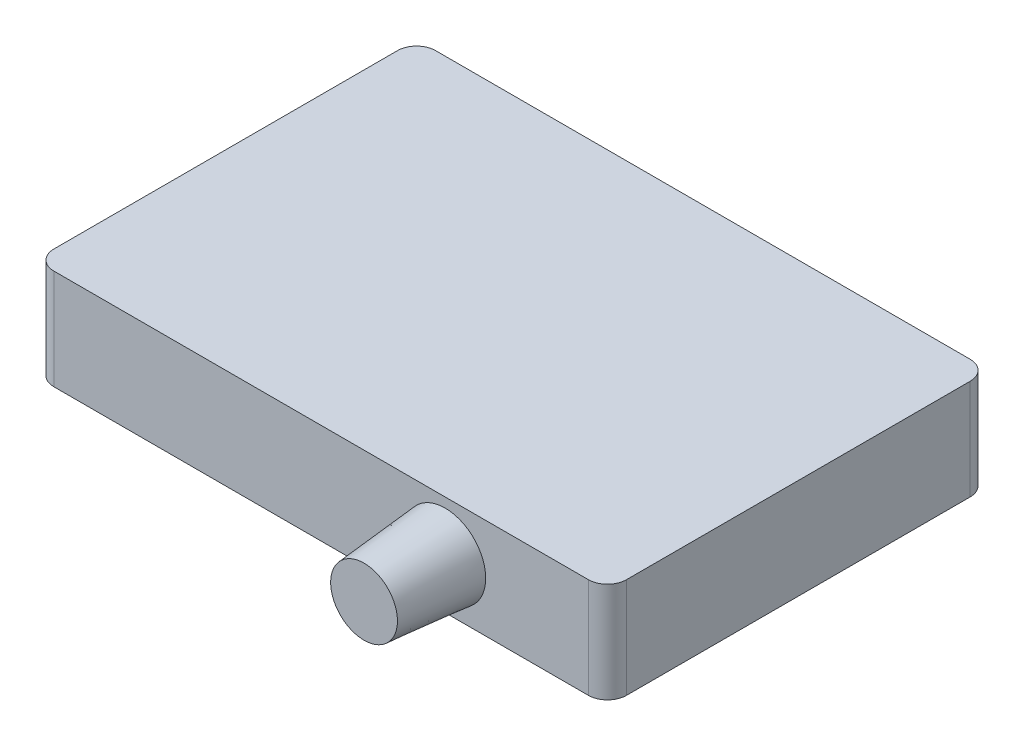
ISO-10303-21;
HEADER;
FILE_DESCRIPTION(('STEP AP214'),'2;1');
FILE_NAME('part.step','',(''),(''),'','','');
FILE_SCHEMA(('AUTOMOTIVE_DESIGN { 1 0 10303 214 1 1 1 1 }'));
ENDSEC;
DATA;
#1=APPLICATION_CONTEXT('core data for automotive mechanical design processes');
#2=APPLICATION_PROTOCOL_DEFINITION('international standard','automotive_design',2000,#1);
#3=PRODUCT_CONTEXT('',#1,'mechanical');
#4=PRODUCT('Part','Part','',(#3));
#5=PRODUCT_RELATED_PRODUCT_CATEGORY('part','',(#4));
#6=PRODUCT_DEFINITION_FORMATION('','',#4);
#7=PRODUCT_DEFINITION_CONTEXT('part definition',#1,'design');
#8=PRODUCT_DEFINITION('design','',#6,#7);
#9=PRODUCT_DEFINITION_SHAPE('','',#8);
#10=(LENGTH_UNIT() NAMED_UNIT(*) SI_UNIT(.MILLI.,.METRE.));
#11=(NAMED_UNIT(*) PLANE_ANGLE_UNIT() SI_UNIT($,.RADIAN.));
#12=(NAMED_UNIT(*) SI_UNIT($,.STERADIAN.) SOLID_ANGLE_UNIT());
#13=UNCERTAINTY_MEASURE_WITH_UNIT(LENGTH_MEASURE(1.E-05),#10,'distance_accuracy_value','');
#14=(GEOMETRIC_REPRESENTATION_CONTEXT(3) GLOBAL_UNCERTAINTY_ASSIGNED_CONTEXT((#13)) GLOBAL_UNIT_ASSIGNED_CONTEXT((#10,
#11,#12)) REPRESENTATION_CONTEXT('',''));
#15=CARTESIAN_POINT('',(0.,0.,0.));
#16=DIRECTION('',(0.,0.,1.));
#17=DIRECTION('',(1.,0.,0.));
#18=AXIS2_PLACEMENT_3D('',#15,#16,#17);
#19=CARTESIAN_POINT('',(-28.,10.5,20.));
#20=DIRECTION('',(0.,0.,-1.));
#21=DIRECTION('',(-1.,0.,0.));
#22=AXIS2_PLACEMENT_3D('',#19,#20,#21);
#23=PLANE('',#22);
#24=DIRECTION('',(1.,0.,0.));
#25=VECTOR('',#24,1.);
#26=CARTESIAN_POINT('',(-28.,0.,20.));
#27=LINE('',#26,#25);
#28=CARTESIAN_POINT('',(-28.,0.,20.));
#29=VERTEX_POINT('',#28);
#30=CARTESIAN_POINT('',(28.,0.,20.));
#31=VERTEX_POINT('',#30);
#32=EDGE_CURVE('E88',#29,#31,#27,.T.);
#33=ORIENTED_EDGE('',*,*,#32,.T.);
#34=DIRECTION('',(0.,-1.,0.));
#35=VECTOR('',#34,1.);
#36=CARTESIAN_POINT('',(28.,10.5,20.));
#37=LINE('',#36,#35);
#38=CARTESIAN_POINT('',(28.,10.5,20.));
#39=VERTEX_POINT('',#38);
#40=EDGE_CURVE('E130',#39,#31,#37,.T.);
#41=ORIENTED_EDGE('',*,*,#40,.F.);
#42=DIRECTION('',(1.,0.,0.));
#43=VECTOR('',#42,1.);
#44=CARTESIAN_POINT('',(-28.,10.5,20.));
#45=LINE('',#44,#43);
#46=CARTESIAN_POINT('',(-28.,10.5,20.));
#47=VERTEX_POINT('',#46);
#48=EDGE_CURVE('E53',#47,#39,#45,.T.);
#49=ORIENTED_EDGE('',*,*,#48,.F.);
#50=DIRECTION('',(0.,-1.,0.));
#51=VECTOR('',#50,1.);
#52=CARTESIAN_POINT('',(-28.,10.5,20.));
#53=LINE('',#52,#51);
#54=EDGE_CURVE('E126',#47,#29,#53,.T.);
#55=ORIENTED_EDGE('',*,*,#54,.T.);
#56=EDGE_LOOP('',(#33,#41,#49,#55));
#57=FACE_BOUND('',#56,.T.);
#58=CARTESIAN_POINT('',(13.,5.25,20.));
#59=DIRECTION('',(0.,0.,-1.));
#60=DIRECTION('',(-1.,0.,0.));
#61=AXIS2_PLACEMENT_3D('',#58,#59,#60);
#62=CIRCLE('',#61,4.24365363997036);
#63=CARTESIAN_POINT('',(8.75634636002963,5.25,20.));
#64=VERTEX_POINT('',#63);
#65=EDGE_CURVE('E11',#64,#64,#62,.F.);
#66=ORIENTED_EDGE('',*,*,#65,.F.);
#67=EDGE_LOOP('',(#66));
#68=FACE_BOUND('',#67,.T.);
#69=ADVANCED_FACE('F36',(#57,#68),#23,.F.);
#70=CARTESIAN_POINT('',(-28.,10.5,-20.));
#71=DIRECTION('',(0.,0.,1.));
#72=DIRECTION('',(1.,0.,0.));
#73=AXIS2_PLACEMENT_3D('',#70,#71,#72);
#74=PLANE('',#73);
#75=CARTESIAN_POINT('',(12.,4.,-20.));
#76=DIRECTION('',(0.,0.,1.));
#77=DIRECTION('',(1.,0.,0.));
#78=AXIS2_PLACEMENT_3D('',#75,#76,#77);
#79=CIRCLE('',#78,2.75);
#80=CARTESIAN_POINT('',(14.75,4.,-20.));
#81=VERTEX_POINT('',#80);
#82=EDGE_CURVE('E167',#81,#81,#79,.F.);
#83=ORIENTED_EDGE('',*,*,#82,.F.);
#84=EDGE_LOOP('',(#83));
#85=FACE_BOUND('',#84,.T.);
#86=DIRECTION('',(-1.,0.,0.));
#87=VECTOR('',#86,1.);
#88=CARTESIAN_POINT('',(-28.,0.,-20.));
#89=LINE('',#88,#87);
#90=CARTESIAN_POINT('',(28.,0.,-20.));
#91=VERTEX_POINT('',#90);
#92=CARTESIAN_POINT('',(-28.,0.,-20.));
#93=VERTEX_POINT('',#92);
#94=EDGE_CURVE('E142',#91,#93,#89,.T.);
#95=ORIENTED_EDGE('',*,*,#94,.T.);
#96=DIRECTION('',(0.,-1.,0.));
#97=VECTOR('',#96,1.);
#98=CARTESIAN_POINT('',(-28.,10.5,-20.));
#99=LINE('',#98,#97);
#100=CARTESIAN_POINT('',(-28.,10.5,-20.));
#101=VERTEX_POINT('',#100);
#102=EDGE_CURVE('E153',#101,#93,#99,.T.);
#103=ORIENTED_EDGE('',*,*,#102,.F.);
#104=DIRECTION('',(-1.,0.,0.));
#105=VECTOR('',#104,1.);
#106=CARTESIAN_POINT('',(-28.,10.5,-20.));
#107=LINE('',#106,#105);
#108=CARTESIAN_POINT('',(28.,10.5,-20.));
#109=VERTEX_POINT('',#108);
#110=EDGE_CURVE('E227',#109,#101,#107,.T.);
#111=ORIENTED_EDGE('',*,*,#110,.F.);
#112=DIRECTION('',(0.,-1.,0.));
#113=VECTOR('',#112,1.);
#114=CARTESIAN_POINT('',(28.,10.5,-20.));
#115=LINE('',#114,#113);
#116=EDGE_CURVE('E156',#109,#91,#115,.T.);
#117=ORIENTED_EDGE('',*,*,#116,.T.);
#118=EDGE_LOOP('',(#95,#103,#111,#117));
#119=FACE_BOUND('',#118,.T.);
#120=CARTESIAN_POINT('',(18.,4.,-20.));
#121=DIRECTION('',(0.,0.,1.));
#122=DIRECTION('',(1.,0.,0.));
#123=AXIS2_PLACEMENT_3D('',#120,#121,#122);
#124=CIRCLE('',#123,2.75);
#125=CARTESIAN_POINT('',(20.75,4.,-20.));
#126=VERTEX_POINT('',#125);
#127=EDGE_CURVE('E164',#126,#126,#124,.F.);
#128=ORIENTED_EDGE('',*,*,#127,.F.);
#129=EDGE_LOOP('',(#128));
#130=FACE_BOUND('',#129,.T.);
#131=CARTESIAN_POINT('',(5.99999999999999,4.,-20.));
#132=DIRECTION('',(0.,0.,1.));
#133=DIRECTION('',(1.,0.,0.));
#134=AXIS2_PLACEMENT_3D('',#131,#132,#133);
#135=CIRCLE('',#134,2.75);
#136=CARTESIAN_POINT('',(8.74999999999999,4.,-20.));
#137=VERTEX_POINT('',#136);
#138=EDGE_CURVE('E170',#137,#137,#135,.F.);
#139=ORIENTED_EDGE('',*,*,#138,.F.);
#140=EDGE_LOOP('',(#139));
#141=FACE_BOUND('',#140,.T.);
#142=ADVANCED_FACE('F233',(#85,#119,#130,#141),#74,.F.);
#143=CARTESIAN_POINT('',(28.,10.5,18.));
#144=DIRECTION('',(0.,-1.,0.));
#145=DIRECTION('',(0.,0.,-1.));
#146=AXIS2_PLACEMENT_3D('',#143,#144,#145);
#147=CYLINDRICAL_SURFACE('',#146,2.);
#148=CARTESIAN_POINT('',(28.,0.,18.));
#149=DIRECTION('',(0.,1.,0.));
#150=DIRECTION('',(0.,0.,1.));
#151=AXIS2_PLACEMENT_3D('',#148,#149,#150);
#152=CIRCLE('',#151,2.);
#153=CARTESIAN_POINT('',(30.,0.,18.));
#154=VERTEX_POINT('',#153);
#155=EDGE_CURVE('E134',#31,#154,#152,.T.);
#156=ORIENTED_EDGE('',*,*,#155,.T.);
#157=DIRECTION('',(0.,-1.,0.));
#158=VECTOR('',#157,1.);
#159=CARTESIAN_POINT('',(30.,10.5,18.));
#160=LINE('',#159,#158);
#161=CARTESIAN_POINT('',(30.,10.5,18.));
#162=VERTEX_POINT('',#161);
#163=EDGE_CURVE('E162',#162,#154,#160,.T.);
#164=ORIENTED_EDGE('',*,*,#163,.F.);
#165=CARTESIAN_POINT('',(28.,10.5,18.));
#166=DIRECTION('',(0.,1.,0.));
#167=DIRECTION('',(0.,0.,1.));
#168=AXIS2_PLACEMENT_3D('',#165,#166,#167);
#169=CIRCLE('',#168,2.);
#170=EDGE_CURVE('E149',#39,#162,#169,.T.);
#171=ORIENTED_EDGE('',*,*,#170,.F.);
#172=ORIENTED_EDGE('',*,*,#40,.T.);
#173=EDGE_LOOP('',(#156,#164,#171,#172));
#174=FACE_BOUND('',#173,.T.);
#175=ADVANCED_FACE('F244',(#174),#147,.T.);
#176=CARTESIAN_POINT('',(30.,10.5,-18.));
#177=DIRECTION('',(-1.,0.,0.));
#178=DIRECTION('',(0.,0.,1.));
#179=AXIS2_PLACEMENT_3D('',#176,#177,#178);
#180=PLANE('',#179);
#181=DIRECTION('',(0.,0.,-1.));
#182=VECTOR('',#181,1.);
#183=CARTESIAN_POINT('',(30.,0.,-18.));
#184=LINE('',#183,#182);
#185=CARTESIAN_POINT('',(30.,0.,-18.));
#186=VERTEX_POINT('',#185);
#187=EDGE_CURVE('E137',#154,#186,#184,.T.);
#188=ORIENTED_EDGE('',*,*,#187,.T.);
#189=DIRECTION('',(0.,-1.,0.));
#190=VECTOR('',#189,1.);
#191=CARTESIAN_POINT('',(30.,10.5,-18.));
#192=LINE('',#191,#190);
#193=CARTESIAN_POINT('',(30.,10.5,-18.));
#194=VERTEX_POINT('',#193);
#195=EDGE_CURVE('E159',#194,#186,#192,.T.);
#196=ORIENTED_EDGE('',*,*,#195,.F.);
#197=DIRECTION('',(0.,0.,-1.));
#198=VECTOR('',#197,1.);
#199=CARTESIAN_POINT('',(30.,10.5,-18.));
#200=LINE('',#199,#198);
#201=EDGE_CURVE('E97',#162,#194,#200,.T.);
#202=ORIENTED_EDGE('',*,*,#201,.F.);
#203=ORIENTED_EDGE('',*,*,#163,.T.);
#204=EDGE_LOOP('',(#188,#196,#202,#203));
#205=FACE_BOUND('',#204,.T.);
#206=ADVANCED_FACE('F329',(#205),#180,.F.);
#207=CARTESIAN_POINT('',(28.,10.5,-18.));
#208=DIRECTION('',(0.,-1.,0.));
#209=DIRECTION('',(0.,0.,-1.));
#210=AXIS2_PLACEMENT_3D('',#207,#208,#209);
#211=CYLINDRICAL_SURFACE('',#210,2.);
#212=CARTESIAN_POINT('',(28.,0.,-18.));
#213=DIRECTION('',(0.,1.,0.));
#214=DIRECTION('',(0.,0.,1.));
#215=AXIS2_PLACEMENT_3D('',#212,#213,#214);
#216=CIRCLE('',#215,2.);
#217=EDGE_CURVE('E140',#186,#91,#216,.T.);
#218=ORIENTED_EDGE('',*,*,#217,.T.);
#219=ORIENTED_EDGE('',*,*,#116,.F.);
#220=CARTESIAN_POINT('',(28.,10.5,-18.));
#221=DIRECTION('',(0.,1.,0.));
#222=DIRECTION('',(0.,0.,1.));
#223=AXIS2_PLACEMENT_3D('',#220,#221,#222);
#224=CIRCLE('',#223,2.);
#225=EDGE_CURVE('E225',#194,#109,#224,.T.);
#226=ORIENTED_EDGE('',*,*,#225,.F.);
#227=ORIENTED_EDGE('',*,*,#195,.T.);
#228=EDGE_LOOP('',(#218,#219,#226,#227));
#229=FACE_BOUND('',#228,.T.);
#230=ADVANCED_FACE('F323',(#229),#211,.T.);
#231=CARTESIAN_POINT('',(-28.,10.5,-18.));
#232=DIRECTION('',(0.,-1.,0.));
#233=DIRECTION('',(0.,0.,-1.));
#234=AXIS2_PLACEMENT_3D('',#231,#232,#233);
#235=CYLINDRICAL_SURFACE('',#234,2.);
#236=CARTESIAN_POINT('',(-28.,0.,-18.));
#237=DIRECTION('',(0.,1.,0.));
#238=DIRECTION('',(0.,0.,1.));
#239=AXIS2_PLACEMENT_3D('',#236,#237,#238);
#240=CIRCLE('',#239,2.);
#241=CARTESIAN_POINT('',(-30.,0.,-18.));
#242=VERTEX_POINT('',#241);
#243=EDGE_CURVE('E144',#93,#242,#240,.T.);
#244=ORIENTED_EDGE('',*,*,#243,.T.);
#245=DIRECTION('',(0.,-1.,0.));
#246=VECTOR('',#245,1.);
#247=CARTESIAN_POINT('',(-30.,10.5,-18.));
#248=LINE('',#247,#246);
#249=CARTESIAN_POINT('',(-30.,10.5,-18.));
#250=VERTEX_POINT('',#249);
#251=EDGE_CURVE('E125',#250,#242,#248,.T.);
#252=ORIENTED_EDGE('',*,*,#251,.F.);
#253=CARTESIAN_POINT('',(-28.,10.5,-18.));
#254=DIRECTION('',(0.,1.,0.));
#255=DIRECTION('',(0.,0.,1.));
#256=AXIS2_PLACEMENT_3D('',#253,#254,#255);
#257=CIRCLE('',#256,2.);
#258=EDGE_CURVE('E116',#101,#250,#257,.T.);
#259=ORIENTED_EDGE('',*,*,#258,.F.);
#260=ORIENTED_EDGE('',*,*,#102,.T.);
#261=EDGE_LOOP('',(#244,#252,#259,#260));
#262=FACE_BOUND('',#261,.T.);
#263=ADVANCED_FACE('F238',(#262),#235,.T.);
#264=CARTESIAN_POINT('',(-30.,10.5,-18.));
#265=DIRECTION('',(1.,0.,0.));
#266=DIRECTION('',(0.,0.,-1.));
#267=AXIS2_PLACEMENT_3D('',#264,#265,#266);
#268=PLANE('',#267);
#269=DIRECTION('',(0.,0.,1.));
#270=VECTOR('',#269,1.);
#271=CARTESIAN_POINT('',(-30.,0.,-18.));
#272=LINE('',#271,#270);
#273=CARTESIAN_POINT('',(-30.,0.,18.));
#274=VERTEX_POINT('',#273);
#275=EDGE_CURVE('E124',#242,#274,#272,.T.);
#276=ORIENTED_EDGE('',*,*,#275,.T.);
#277=DIRECTION('',(0.,-1.,0.));
#278=VECTOR('',#277,1.);
#279=CARTESIAN_POINT('',(-30.,10.5,18.));
#280=LINE('',#279,#278);
#281=CARTESIAN_POINT('',(-30.,10.5,18.));
#282=VERTEX_POINT('',#281);
#283=EDGE_CURVE('E121',#282,#274,#280,.T.);
#284=ORIENTED_EDGE('',*,*,#283,.F.);
#285=DIRECTION('',(0.,0.,1.));
#286=VECTOR('',#285,1.);
#287=CARTESIAN_POINT('',(-30.,10.5,-18.));
#288=LINE('',#287,#286);
#289=EDGE_CURVE('E110',#250,#282,#288,.T.);
#290=ORIENTED_EDGE('',*,*,#289,.F.);
#291=ORIENTED_EDGE('',*,*,#251,.T.);
#292=EDGE_LOOP('',(#276,#284,#290,#291));
#293=FACE_BOUND('',#292,.T.);
#294=ADVANCED_FACE('F122',(#293),#268,.F.);
#295=CARTESIAN_POINT('',(-28.,10.5,18.));
#296=DIRECTION('',(0.,-1.,0.));
#297=DIRECTION('',(0.,0.,-1.));
#298=AXIS2_PLACEMENT_3D('',#295,#296,#297);
#299=CYLINDRICAL_SURFACE('',#298,2.);
#300=CARTESIAN_POINT('',(-28.,0.,18.));
#301=DIRECTION('',(0.,1.,0.));
#302=DIRECTION('',(0.,0.,-1.));
#303=AXIS2_PLACEMENT_3D('',#300,#301,#302);
#304=CIRCLE('',#303,2.);
#305=EDGE_CURVE('E82',#274,#29,#304,.T.);
#306=ORIENTED_EDGE('',*,*,#305,.T.);
#307=ORIENTED_EDGE('',*,*,#54,.F.);
#308=CARTESIAN_POINT('',(-28.,10.5,18.));
#309=DIRECTION('',(0.,1.,0.));
#310=DIRECTION('',(0.,0.,-1.));
#311=AXIS2_PLACEMENT_3D('',#308,#309,#310);
#312=CIRCLE('',#311,2.);
#313=EDGE_CURVE('E114',#282,#47,#312,.T.);
#314=ORIENTED_EDGE('',*,*,#313,.F.);
#315=ORIENTED_EDGE('',*,*,#283,.T.);
#316=EDGE_LOOP('',(#306,#307,#314,#315));
#317=FACE_BOUND('',#316,.T.);
#318=ADVANCED_FACE('F128',(#317),#299,.T.);
#319=CARTESIAN_POINT('',(28.,10.5,18.));
#320=DIRECTION('',(0.,1.,0.));
#321=DIRECTION('',(0.,0.,1.));
#322=AXIS2_PLACEMENT_3D('',#319,#320,#321);
#323=PLANE('',#322);
#324=ORIENTED_EDGE('',*,*,#170,.T.);
#325=ORIENTED_EDGE('',*,*,#201,.T.);
#326=ORIENTED_EDGE('',*,*,#225,.T.);
#327=ORIENTED_EDGE('',*,*,#110,.T.);
#328=ORIENTED_EDGE('',*,*,#258,.T.);
#329=ORIENTED_EDGE('',*,*,#289,.T.);
#330=ORIENTED_EDGE('',*,*,#313,.T.);
#331=ORIENTED_EDGE('',*,*,#48,.T.);
#332=EDGE_LOOP('',(#324,#325,#326,#327,#328,#329,#330,#331));
#333=FACE_BOUND('',#332,.T.);
#334=ADVANCED_FACE('F112',(#333),#323,.T.);
#335=CARTESIAN_POINT('',(28.,0.,18.));
#336=DIRECTION('',(0.,1.,0.));
#337=DIRECTION('',(0.,0.,1.));
#338=AXIS2_PLACEMENT_3D('',#335,#336,#337);
#339=PLANE('',#338);
#340=ORIENTED_EDGE('',*,*,#155,.F.);
#341=ORIENTED_EDGE('',*,*,#32,.F.);
#342=ORIENTED_EDGE('',*,*,#305,.F.);
#343=ORIENTED_EDGE('',*,*,#275,.F.);
#344=ORIENTED_EDGE('',*,*,#243,.F.);
#345=ORIENTED_EDGE('',*,*,#94,.F.);
#346=ORIENTED_EDGE('',*,*,#217,.F.);
#347=ORIENTED_EDGE('',*,*,#187,.F.);
#348=EDGE_LOOP('',(#340,#341,#342,#343,#344,#345,#346,#347));
#349=FACE_BOUND('',#348,.T.);
#350=ADVANCED_FACE('F202',(#349),#339,.F.);
#351=CARTESIAN_POINT('',(18.,4.,-20.5));
#352=DIRECTION('',(0.,0.,-1.));
#353=DIRECTION('',(-1.,0.,0.));
#354=AXIS2_PLACEMENT_3D('',#351,#352,#353);
#355=PLANE('',#354);
#356=CARTESIAN_POINT('',(18.,4.,-20.5));
#357=DIRECTION('',(0.,0.,-1.));
#358=DIRECTION('',(-1.,0.,0.));
#359=AXIS2_PLACEMENT_3D('',#356,#357,#358);
#360=CIRCLE('',#359,2.5);
#361=CARTESIAN_POINT('',(15.5,4.,-20.5));
#362=VERTEX_POINT('',#361);
#363=EDGE_CURVE('E185',#362,#362,#360,.T.);
#364=ORIENTED_EDGE('',*,*,#363,.T.);
#365=EDGE_LOOP('',(#364));
#366=FACE_BOUND('',#365,.T.);
#367=CARTESIAN_POINT('',(18.,4.,-20.5));
#368=DIRECTION('',(0.,0.,-1.));
#369=DIRECTION('',(-1.,0.,0.));
#370=AXIS2_PLACEMENT_3D('',#367,#368,#369);
#371=CIRCLE('',#370,2.25);
#372=CARTESIAN_POINT('',(15.75,4.,-20.5));
#373=VERTEX_POINT('',#372);
#374=EDGE_CURVE('E206',#373,#373,#371,.T.);
#375=ORIENTED_EDGE('',*,*,#374,.F.);
#376=EDGE_LOOP('',(#375));
#377=FACE_BOUND('',#376,.T.);
#378=ADVANCED_FACE('F199',(#366,#377),#355,.T.);
#379=CARTESIAN_POINT('',(18.,4.,-20.5));
#380=DIRECTION('',(0.,0.,1.));
#381=DIRECTION('',(1.,0.,0.));
#382=AXIS2_PLACEMENT_3D('',#379,#380,#381);
#383=CYLINDRICAL_SURFACE('',#382,2.75);
#384=CARTESIAN_POINT('',(18.,4.,-20.25));
#385=DIRECTION('',(0.,0.,-1.));
#386=DIRECTION('',(-1.,0.,0.));
#387=AXIS2_PLACEMENT_3D('',#384,#385,#386);
#388=CIRCLE('',#387,2.75);
#389=CARTESIAN_POINT('',(15.25,4.,-20.25));
#390=VERTEX_POINT('',#389);
#391=EDGE_CURVE('E45',#390,#390,#388,.F.);
#392=ORIENTED_EDGE('',*,*,#391,.T.);
#393=EDGE_LOOP('',(#392));
#394=FACE_BOUND('',#393,.T.);
#395=ORIENTED_EDGE('',*,*,#127,.T.);
#396=EDGE_LOOP('',(#395));
#397=FACE_BOUND('',#396,.T.);
#398=ADVANCED_FACE('F190',(#394,#397),#383,.T.);
#399=CARTESIAN_POINT('',(18.,4.,-16.));
#400=DIRECTION('',(0.,0.,-1.));
#401=DIRECTION('',(-1.,0.,0.));
#402=AXIS2_PLACEMENT_3D('',#399,#400,#401);
#403=PLANE('',#402);
#404=CARTESIAN_POINT('',(18.,4.,-16.));
#405=DIRECTION('',(0.,0.,-1.));
#406=DIRECTION('',(-1.,0.,0.));
#407=AXIS2_PLACEMENT_3D('',#404,#405,#406);
#408=CIRCLE('',#407,2.25);
#409=CARTESIAN_POINT('',(15.75,4.,-16.));
#410=VERTEX_POINT('',#409);
#411=EDGE_CURVE('E138',#410,#410,#408,.T.);
#412=ORIENTED_EDGE('',*,*,#411,.T.);
#413=EDGE_LOOP('',(#412));
#414=FACE_BOUND('',#413,.T.);
#415=ADVANCED_FACE('F296',(#414),#403,.T.);
#416=CARTESIAN_POINT('',(18.,4.,-16.));
#417=DIRECTION('',(0.,0.,-1.));
#418=DIRECTION('',(-1.,0.,0.));
#419=AXIS2_PLACEMENT_3D('',#416,#417,#418);
#420=CYLINDRICAL_SURFACE('',#419,2.25);
#421=ORIENTED_EDGE('',*,*,#411,.F.);
#422=EDGE_LOOP('',(#421));
#423=FACE_BOUND('',#422,.T.);
#424=ORIENTED_EDGE('',*,*,#374,.T.);
#425=EDGE_LOOP('',(#424));
#426=FACE_BOUND('',#425,.T.);
#427=ADVANCED_FACE('F289',(#423,#426),#420,.F.);
#428=CARTESIAN_POINT('',(12.,4.,-20.5));
#429=DIRECTION('',(0.,0.,-1.));
#430=DIRECTION('',(-1.,0.,0.));
#431=AXIS2_PLACEMENT_3D('',#428,#429,#430);
#432=PLANE('',#431);
#433=CARTESIAN_POINT('',(12.,4.,-20.5));
#434=DIRECTION('',(0.,0.,-1.));
#435=DIRECTION('',(-1.,0.,0.));
#436=AXIS2_PLACEMENT_3D('',#433,#434,#435);
#437=CIRCLE('',#436,2.49999999999999);
#438=CARTESIAN_POINT('',(9.5,4.,-20.5));
#439=VERTEX_POINT('',#438);
#440=EDGE_CURVE('E179',#439,#439,#437,.T.);
#441=ORIENTED_EDGE('',*,*,#440,.T.);
#442=EDGE_LOOP('',(#441));
#443=FACE_BOUND('',#442,.T.);
#444=CARTESIAN_POINT('',(12.,4.,-20.5));
#445=DIRECTION('',(0.,0.,-1.));
#446=DIRECTION('',(-1.,0.,0.));
#447=AXIS2_PLACEMENT_3D('',#444,#445,#446);
#448=CIRCLE('',#447,2.25);
#449=CARTESIAN_POINT('',(9.74999999999999,4.,-20.5));
#450=VERTEX_POINT('',#449);
#451=EDGE_CURVE('E209',#450,#450,#448,.T.);
#452=ORIENTED_EDGE('',*,*,#451,.F.);
#453=EDGE_LOOP('',(#452));
#454=FACE_BOUND('',#453,.T.);
#455=ADVANCED_FACE('F285',(#443,#454),#432,.T.);
#456=CARTESIAN_POINT('',(12.,4.,-20.5));
#457=DIRECTION('',(0.,0.,1.));
#458=DIRECTION('',(1.,0.,0.));
#459=AXIS2_PLACEMENT_3D('',#456,#457,#458);
#460=CYLINDRICAL_SURFACE('',#459,2.75);
#461=CARTESIAN_POINT('',(12.,4.,-20.25));
#462=DIRECTION('',(0.,0.,-1.));
#463=DIRECTION('',(-1.,0.,0.));
#464=AXIS2_PLACEMENT_3D('',#461,#462,#463);
#465=CIRCLE('',#464,2.75);
#466=CARTESIAN_POINT('',(9.24999999999999,4.,-20.25));
#467=VERTEX_POINT('',#466);
#468=EDGE_CURVE('E182',#467,#467,#465,.F.);
#469=ORIENTED_EDGE('',*,*,#468,.T.);
#470=EDGE_LOOP('',(#469));
#471=FACE_BOUND('',#470,.T.);
#472=ORIENTED_EDGE('',*,*,#82,.T.);
#473=EDGE_LOOP('',(#472));
#474=FACE_BOUND('',#473,.T.);
#475=ADVANCED_FACE('F288',(#471,#474),#460,.T.);
#476=CARTESIAN_POINT('',(12.,4.,-16.));
#477=DIRECTION('',(0.,0.,-1.));
#478=DIRECTION('',(-1.,0.,0.));
#479=AXIS2_PLACEMENT_3D('',#476,#477,#478);
#480=PLANE('',#479);
#481=CARTESIAN_POINT('',(12.,4.,-16.));
#482=DIRECTION('',(0.,0.,-1.));
#483=DIRECTION('',(-1.,0.,0.));
#484=AXIS2_PLACEMENT_3D('',#481,#482,#483);
#485=CIRCLE('',#484,2.25);
#486=CARTESIAN_POINT('',(9.74999999999999,4.,-16.));
#487=VERTEX_POINT('',#486);
#488=EDGE_CURVE('E212',#487,#487,#485,.T.);
#489=ORIENTED_EDGE('',*,*,#488,.T.);
#490=EDGE_LOOP('',(#489));
#491=FACE_BOUND('',#490,.T.);
#492=ADVANCED_FACE('F281',(#491),#480,.T.);
#493=CARTESIAN_POINT('',(12.,4.,-16.));
#494=DIRECTION('',(0.,0.,-1.));
#495=DIRECTION('',(-1.,0.,0.));
#496=AXIS2_PLACEMENT_3D('',#493,#494,#495);
#497=CYLINDRICAL_SURFACE('',#496,2.25);
#498=ORIENTED_EDGE('',*,*,#488,.F.);
#499=EDGE_LOOP('',(#498));
#500=FACE_BOUND('',#499,.T.);
#501=ORIENTED_EDGE('',*,*,#451,.T.);
#502=EDGE_LOOP('',(#501));
#503=FACE_BOUND('',#502,.T.);
#504=ADVANCED_FACE('F271',(#500,#503),#497,.F.);
#505=CARTESIAN_POINT('',(5.99999999999999,4.,-20.5));
#506=DIRECTION('',(0.,0.,-1.));
#507=DIRECTION('',(-1.,0.,0.));
#508=AXIS2_PLACEMENT_3D('',#505,#506,#507);
#509=PLANE('',#508);
#510=CARTESIAN_POINT('',(5.99999999999999,4.,-20.5));
#511=DIRECTION('',(0.,0.,-1.));
#512=DIRECTION('',(-1.,0.,0.));
#513=AXIS2_PLACEMENT_3D('',#510,#511,#512);
#514=CIRCLE('',#513,2.49999999999999);
#515=CARTESIAN_POINT('',(3.5,4.,-20.5));
#516=VERTEX_POINT('',#515);
#517=EDGE_CURVE('E173',#516,#516,#514,.T.);
#518=ORIENTED_EDGE('',*,*,#517,.T.);
#519=EDGE_LOOP('',(#518));
#520=FACE_BOUND('',#519,.T.);
#521=CARTESIAN_POINT('',(5.99999999999999,4.,-20.5));
#522=DIRECTION('',(0.,0.,-1.));
#523=DIRECTION('',(-1.,0.,0.));
#524=AXIS2_PLACEMENT_3D('',#521,#522,#523);
#525=CIRCLE('',#524,2.25);
#526=CARTESIAN_POINT('',(3.74999999999999,4.,-20.5));
#527=VERTEX_POINT('',#526);
#528=EDGE_CURVE('E215',#527,#527,#525,.T.);
#529=ORIENTED_EDGE('',*,*,#528,.F.);
#530=EDGE_LOOP('',(#529));
#531=FACE_BOUND('',#530,.T.);
#532=ADVANCED_FACE('F268',(#520,#531),#509,.T.);
#533=CARTESIAN_POINT('',(5.99999999999999,4.,-20.5));
#534=DIRECTION('',(0.,0.,1.));
#535=DIRECTION('',(1.,0.,0.));
#536=AXIS2_PLACEMENT_3D('',#533,#534,#535);
#537=CYLINDRICAL_SURFACE('',#536,2.75);
#538=CARTESIAN_POINT('',(5.99999999999999,4.,-20.25));
#539=DIRECTION('',(0.,0.,-1.));
#540=DIRECTION('',(-1.,0.,0.));
#541=AXIS2_PLACEMENT_3D('',#538,#539,#540);
#542=CIRCLE('',#541,2.75);
#543=CARTESIAN_POINT('',(3.24999999999999,4.,-20.25));
#544=VERTEX_POINT('',#543);
#545=EDGE_CURVE('E176',#544,#544,#542,.F.);
#546=ORIENTED_EDGE('',*,*,#545,.T.);
#547=EDGE_LOOP('',(#546));
#548=FACE_BOUND('',#547,.T.);
#549=ORIENTED_EDGE('',*,*,#138,.T.);
#550=EDGE_LOOP('',(#549));
#551=FACE_BOUND('',#550,.T.);
#552=ADVANCED_FACE('F270',(#548,#551),#537,.T.);
#553=CARTESIAN_POINT('',(5.99999999999999,4.,-16.));
#554=DIRECTION('',(0.,0.,-1.));
#555=DIRECTION('',(-1.,0.,0.));
#556=AXIS2_PLACEMENT_3D('',#553,#554,#555);
#557=PLANE('',#556);
#558=CARTESIAN_POINT('',(5.99999999999999,4.,-16.));
#559=DIRECTION('',(0.,0.,-1.));
#560=DIRECTION('',(-1.,0.,0.));
#561=AXIS2_PLACEMENT_3D('',#558,#559,#560);
#562=CIRCLE('',#561,2.25);
#563=CARTESIAN_POINT('',(3.74999999999999,4.,-16.));
#564=VERTEX_POINT('',#563);
#565=EDGE_CURVE('E208',#564,#564,#562,.T.);
#566=ORIENTED_EDGE('',*,*,#565,.T.);
#567=EDGE_LOOP('',(#566));
#568=FACE_BOUND('',#567,.T.);
#569=ADVANCED_FACE('F278',(#568),#557,.T.);
#570=CARTESIAN_POINT('',(5.99999999999999,4.,-16.));
#571=DIRECTION('',(0.,0.,-1.));
#572=DIRECTION('',(-1.,0.,0.));
#573=AXIS2_PLACEMENT_3D('',#570,#571,#572);
#574=CYLINDRICAL_SURFACE('',#573,2.25);
#575=ORIENTED_EDGE('',*,*,#565,.F.);
#576=EDGE_LOOP('',(#575));
#577=FACE_BOUND('',#576,.T.);
#578=ORIENTED_EDGE('',*,*,#528,.T.);
#579=EDGE_LOOP('',(#578));
#580=FACE_BOUND('',#579,.T.);
#581=ADVANCED_FACE('F266',(#577,#580),#574,.F.);
#582=CARTESIAN_POINT('',(5.99999999999999,4.,-20.5));
#583=DIRECTION('',(0.,0.,1.));
#584=DIRECTION('',(1.,0.,0.));
#585=AXIS2_PLACEMENT_3D('',#582,#583,#584);
#586=CONICAL_SURFACE('',#585,2.49999999999999,0.785398163397434);
#587=ORIENTED_EDGE('',*,*,#545,.F.);
#588=EDGE_LOOP('',(#587));
#589=FACE_BOUND('',#588,.T.);
#590=ORIENTED_EDGE('',*,*,#517,.F.);
#591=EDGE_LOOP('',(#590));
#592=FACE_BOUND('',#591,.T.);
#593=ADVANCED_FACE('F302',(#589,#592),#586,.T.);
#594=CARTESIAN_POINT('',(12.,4.,-20.5));
#595=DIRECTION('',(0.,0.,1.));
#596=DIRECTION('',(1.,0.,0.));
#597=AXIS2_PLACEMENT_3D('',#594,#595,#596);
#598=CONICAL_SURFACE('',#597,2.49999999999999,0.785398163397434);
#599=ORIENTED_EDGE('',*,*,#468,.F.);
#600=EDGE_LOOP('',(#599));
#601=FACE_BOUND('',#600,.T.);
#602=ORIENTED_EDGE('',*,*,#440,.F.);
#603=EDGE_LOOP('',(#602));
#604=FACE_BOUND('',#603,.T.);
#605=ADVANCED_FACE('F196',(#601,#604),#598,.T.);
#606=CARTESIAN_POINT('',(18.,4.,-20.5));
#607=DIRECTION('',(0.,0.,1.));
#608=DIRECTION('',(1.,0.,0.));
#609=AXIS2_PLACEMENT_3D('',#606,#607,#608);
#610=CONICAL_SURFACE('',#609,2.5,0.785398163397455);
#611=ORIENTED_EDGE('',*,*,#391,.F.);
#612=EDGE_LOOP('',(#611));
#613=FACE_BOUND('',#612,.T.);
#614=ORIENTED_EDGE('',*,*,#363,.F.);
#615=EDGE_LOOP('',(#614));
#616=FACE_BOUND('',#615,.T.);
#617=ADVANCED_FACE('F193',(#613,#616),#610,.T.);
#618=CARTESIAN_POINT('',(13.,5.25,28.5));
#619=DIRECTION('',(0.,0.,-1.));
#620=DIRECTION('',(1.,0.,0.));
#621=AXIS2_PLACEMENT_3D('',#618,#619,#620);
#622=CONICAL_SURFACE('',#621,3.5,0.0872664625997169);
#623=CARTESIAN_POINT('',(13.,5.25,28.5));
#624=DIRECTION('',(0.,0.,1.));
#625=DIRECTION('',(1.,0.,0.));
#626=AXIS2_PLACEMENT_3D('',#623,#624,#625);
#627=CIRCLE('',#626,3.5);
#628=CARTESIAN_POINT('',(16.5,5.25,28.5));
#629=VERTEX_POINT('',#628);
#630=EDGE_CURVE('E261',#629,#629,#627,.T.);
#631=ORIENTED_EDGE('',*,*,#630,.F.);
#632=EDGE_LOOP('',(#631));
#633=FACE_BOUND('',#632,.T.);
#634=ORIENTED_EDGE('',*,*,#65,.T.);
#635=EDGE_LOOP('',(#634));
#636=FACE_BOUND('',#635,.T.);
#637=ADVANCED_FACE('F38',(#633,#636),#622,.T.);
#638=CARTESIAN_POINT('',(13.,5.25,28.5));
#639=DIRECTION('',(0.,0.,1.));
#640=DIRECTION('',(1.,0.,0.));
#641=AXIS2_PLACEMENT_3D('',#638,#639,#640);
#642=PLANE('',#641);
#643=ORIENTED_EDGE('',*,*,#630,.T.);
#644=EDGE_LOOP('',(#643));
#645=FACE_BOUND('',#644,.T.);
#646=ADVANCED_FACE('F252',(#645),#642,.T.);
#647=CLOSED_SHELL('',(#69,#142,#175,#206,#230,#263,#294,#318,#334,#350,#378,#398,#415,#427,#455,
#475,#492,#504,#532,#552,#569,#581,#593,#605,#617,#637,#646));
#648=MANIFOLD_SOLID_BREP('B2',#647);
#649=ADVANCED_BREP_SHAPE_REPRESENTATION('',(#18,#648),#14);
#650=SHAPE_DEFINITION_REPRESENTATION(#9,#649);
ENDSEC;
END-ISO-10303-21;
